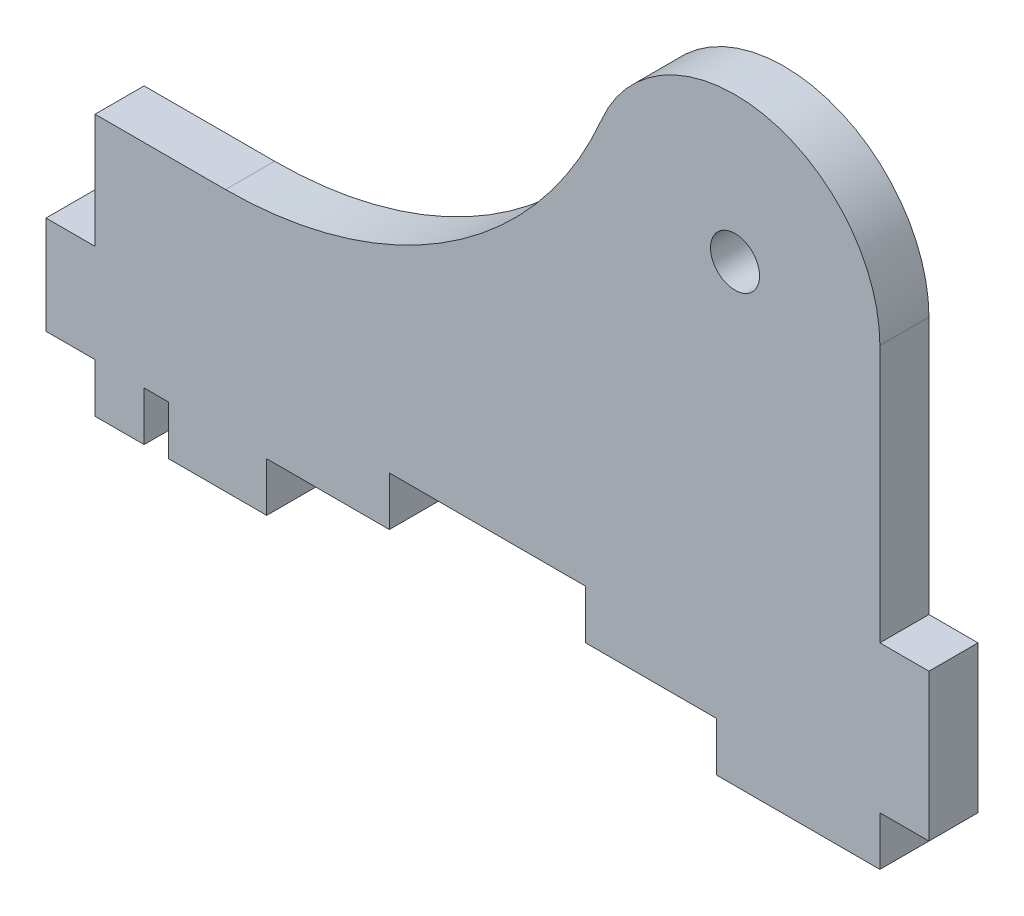
ISO-10303-21;
HEADER;
FILE_DESCRIPTION(('STEP AP214'),'2;1');
FILE_NAME('part.step','',(''),(''),'','','');
FILE_SCHEMA(('AUTOMOTIVE_DESIGN { 1 0 10303 214 1 1 1 1 }'));
ENDSEC;
DATA;
#1=APPLICATION_CONTEXT('core data for automotive mechanical design processes');
#2=APPLICATION_PROTOCOL_DEFINITION('international standard','automotive_design',2000,#1);
#3=PRODUCT_CONTEXT('',#1,'mechanical');
#4=PRODUCT('Part','Part','',(#3));
#5=PRODUCT_RELATED_PRODUCT_CATEGORY('part','',(#4));
#6=PRODUCT_DEFINITION_FORMATION('','',#4);
#7=PRODUCT_DEFINITION_CONTEXT('part definition',#1,'design');
#8=PRODUCT_DEFINITION('design','',#6,#7);
#9=PRODUCT_DEFINITION_SHAPE('','',#8);
#10=(LENGTH_UNIT() NAMED_UNIT(*) SI_UNIT(.MILLI.,.METRE.));
#11=(NAMED_UNIT(*) PLANE_ANGLE_UNIT() SI_UNIT($,.RADIAN.));
#12=(NAMED_UNIT(*) SI_UNIT($,.STERADIAN.) SOLID_ANGLE_UNIT());
#13=UNCERTAINTY_MEASURE_WITH_UNIT(LENGTH_MEASURE(1.E-05),#10,'distance_accuracy_value','');
#14=(GEOMETRIC_REPRESENTATION_CONTEXT(3) GLOBAL_UNCERTAINTY_ASSIGNED_CONTEXT((#13)) GLOBAL_UNIT_ASSIGNED_CONTEXT((#10,
#11,#12)) REPRESENTATION_CONTEXT('',''));
#15=CARTESIAN_POINT('',(0.,0.,0.));
#16=DIRECTION('',(0.,0.,1.));
#17=DIRECTION('',(1.,0.,0.));
#18=AXIS2_PLACEMENT_3D('',#15,#16,#17);
#19=CARTESIAN_POINT('',(0.,0.,-3.));
#20=DIRECTION('',(0.,-1.,0.));
#21=DIRECTION('',(0.,0.,-1.));
#22=AXIS2_PLACEMENT_3D('',#19,#20,#21);
#23=PLANE('',#22);
#24=DIRECTION('',(1.,0.,0.));
#25=VECTOR('',#24,1.);
#26=CARTESIAN_POINT('',(0.,0.,0.));
#27=LINE('',#26,#25);
#28=CARTESIAN_POINT('',(48.,0.,0.));
#29=VERTEX_POINT('',#28);
#30=CARTESIAN_POINT('',(51.,0.,0.));
#31=VERTEX_POINT('',#30);
#32=EDGE_CURVE('E385',#29,#31,#27,.T.);
#33=ORIENTED_EDGE('',*,*,#32,.F.);
#34=DIRECTION('',(0.,0.,1.));
#35=VECTOR('',#34,1.);
#36=CARTESIAN_POINT('',(48.,0.,-3.));
#37=LINE('',#36,#35);
#38=CARTESIAN_POINT('',(48.,0.,-3.));
#39=VERTEX_POINT('',#38);
#40=EDGE_CURVE('E214',#39,#29,#37,.T.);
#41=ORIENTED_EDGE('',*,*,#40,.F.);
#42=DIRECTION('',(1.,0.,0.));
#43=VECTOR('',#42,1.);
#44=CARTESIAN_POINT('',(0.,0.,-3.));
#45=LINE('',#44,#43);
#46=CARTESIAN_POINT('',(51.,0.,-3.));
#47=VERTEX_POINT('',#46);
#48=EDGE_CURVE('E365',#39,#47,#45,.T.);
#49=ORIENTED_EDGE('',*,*,#48,.T.);
#50=DIRECTION('',(0.,0.,1.));
#51=VECTOR('',#50,1.);
#52=CARTESIAN_POINT('',(51.,0.,-3.));
#53=LINE('',#52,#51);
#54=EDGE_CURVE('E247',#47,#31,#53,.T.);
#55=ORIENTED_EDGE('',*,*,#54,.T.);
#56=EDGE_LOOP('',(#33,#41,#49,#55));
#57=FACE_BOUND('',#56,.T.);
#58=ADVANCED_FACE('F36',(#57),#23,.T.);
#59=CARTESIAN_POINT('',(48.,0.,-3.));
#60=DIRECTION('',(1.,0.,0.));
#61=DIRECTION('',(0.,0.,-1.));
#62=AXIS2_PLACEMENT_3D('',#59,#60,#61);
#63=PLANE('',#62);
#64=DIRECTION('',(0.,1.,0.));
#65=VECTOR('',#64,1.);
#66=CARTESIAN_POINT('',(48.,0.,0.));
#67=LINE('',#66,#65);
#68=CARTESIAN_POINT('',(48.,9.,0.));
#69=VERTEX_POINT('',#68);
#70=CARTESIAN_POINT('',(48.,24.75,0.));
#71=VERTEX_POINT('',#70);
#72=EDGE_CURVE('E389',#69,#71,#67,.T.);
#73=ORIENTED_EDGE('',*,*,#72,.F.);
#74=DIRECTION('',(0.,0.,1.));
#75=VECTOR('',#74,1.);
#76=CARTESIAN_POINT('',(48.,9.,-3.));
#77=LINE('',#76,#75);
#78=CARTESIAN_POINT('',(48.,9.,-3.));
#79=VERTEX_POINT('',#78);
#80=EDGE_CURVE('E250',#79,#69,#77,.T.);
#81=ORIENTED_EDGE('',*,*,#80,.F.);
#82=DIRECTION('',(0.,1.,0.));
#83=VECTOR('',#82,1.);
#84=CARTESIAN_POINT('',(48.,0.,-3.));
#85=LINE('',#84,#83);
#86=CARTESIAN_POINT('',(48.,24.75,-3.));
#87=VERTEX_POINT('',#86);
#88=EDGE_CURVE('E370',#79,#87,#85,.T.);
#89=ORIENTED_EDGE('',*,*,#88,.T.);
#90=DIRECTION('',(0.,0.,1.));
#91=VECTOR('',#90,1.);
#92=CARTESIAN_POINT('',(48.,24.75,-3.));
#93=LINE('',#92,#91);
#94=EDGE_CURVE('E40',#87,#71,#93,.T.);
#95=ORIENTED_EDGE('',*,*,#94,.T.);
#96=EDGE_LOOP('',(#73,#81,#89,#95));
#97=FACE_BOUND('',#96,.T.);
#98=ADVANCED_FACE('F409',(#97),#63,.T.);
#99=CARTESIAN_POINT('',(10.5,0.,0.));
#100=VERTEX_POINT('',#99);
#101=CARTESIAN_POINT('',(18.,0.,0.));
#102=VERTEX_POINT('',#101);
#103=EDGE_CURVE('E446',#100,#102,#27,.T.);
#104=ORIENTED_EDGE('',*,*,#103,.F.);
#105=DIRECTION('',(0.,0.,1.));
#106=VECTOR('',#105,1.);
#107=CARTESIAN_POINT('',(10.5,0.,-3.));
#108=LINE('',#107,#106);
#109=CARTESIAN_POINT('',(10.5,0.,-3.));
#110=VERTEX_POINT('',#109);
#111=EDGE_CURVE('E266',#110,#100,#108,.T.);
#112=ORIENTED_EDGE('',*,*,#111,.F.);
#113=CARTESIAN_POINT('',(18.,0.,-3.));
#114=VERTEX_POINT('',#113);
#115=EDGE_CURVE('E512',#110,#114,#45,.T.);
#116=ORIENTED_EDGE('',*,*,#115,.T.);
#117=DIRECTION('',(0.,0.,1.));
#118=VECTOR('',#117,1.);
#119=CARTESIAN_POINT('',(18.,0.,-3.));
#120=LINE('',#119,#118);
#121=EDGE_CURVE('E355',#114,#102,#120,.T.);
#122=ORIENTED_EDGE('',*,*,#121,.T.);
#123=EDGE_LOOP('',(#104,#112,#116,#122));
#124=FACE_BOUND('',#123,.T.);
#125=ADVANCED_FACE('F473',(#124),#23,.T.);
#126=DIRECTION('',(0.,0.,1.));
#127=VECTOR('',#126,1.);
#128=CARTESIAN_POINT('',(4.5,0.,-3.));
#129=LINE('',#128,#127);
#130=CARTESIAN_POINT('',(4.5,0.,-3.));
#131=VERTEX_POINT('',#130);
#132=CARTESIAN_POINT('',(4.5,0.,0.));
#133=VERTEX_POINT('',#132);
#134=EDGE_CURVE('E279',#131,#133,#129,.T.);
#135=ORIENTED_EDGE('',*,*,#134,.T.);
#136=CARTESIAN_POINT('',(3.,0.,0.));
#137=VERTEX_POINT('',#136);
#138=EDGE_CURVE('E390',#137,#133,#27,.T.);
#139=ORIENTED_EDGE('',*,*,#138,.F.);
#140=DIRECTION('',(0.,0.,1.));
#141=VECTOR('',#140,1.);
#142=CARTESIAN_POINT('',(3.,0.,-3.));
#143=LINE('',#142,#141);
#144=CARTESIAN_POINT('',(3.,0.,-3.));
#145=VERTEX_POINT('',#144);
#146=EDGE_CURVE('E284',#145,#137,#143,.T.);
#147=ORIENTED_EDGE('',*,*,#146,.F.);
#148=EDGE_CURVE('E371',#145,#131,#45,.T.);
#149=ORIENTED_EDGE('',*,*,#148,.T.);
#150=EDGE_LOOP('',(#135,#139,#147,#149));
#151=FACE_BOUND('',#150,.T.);
#152=ADVANCED_FACE('F479',(#151),#23,.T.);
#153=CARTESIAN_POINT('',(0.,13.,-3.));
#154=DIRECTION('',(-1.,0.,0.));
#155=DIRECTION('',(0.,0.,1.));
#156=AXIS2_PLACEMENT_3D('',#153,#154,#155);
#157=PLANE('',#156);
#158=DIRECTION('',(0.,-1.,0.));
#159=VECTOR('',#158,1.);
#160=CARTESIAN_POINT('',(0.,13.,-3.));
#161=LINE('',#160,#159);
#162=CARTESIAN_POINT('',(0.,13.,-3.));
#163=VERTEX_POINT('',#162);
#164=CARTESIAN_POINT('',(0.,6.,-3.));
#165=VERTEX_POINT('',#164);
#166=EDGE_CURVE('E362',#163,#165,#161,.T.);
#167=ORIENTED_EDGE('',*,*,#166,.T.);
#168=DIRECTION('',(0.,0.,1.));
#169=VECTOR('',#168,1.);
#170=CARTESIAN_POINT('',(0.,6.,-3.));
#171=LINE('',#170,#169);
#172=CARTESIAN_POINT('',(0.,6.,0.));
#173=VERTEX_POINT('',#172);
#174=EDGE_CURVE('E325',#165,#173,#171,.T.);
#175=ORIENTED_EDGE('',*,*,#174,.T.);
#176=DIRECTION('',(0.,-1.,0.));
#177=VECTOR('',#176,1.);
#178=CARTESIAN_POINT('',(0.,13.,0.));
#179=LINE('',#178,#177);
#180=CARTESIAN_POINT('',(0.,13.,0.));
#181=VERTEX_POINT('',#180);
#182=EDGE_CURVE('E354',#181,#173,#179,.T.);
#183=ORIENTED_EDGE('',*,*,#182,.F.);
#184=DIRECTION('',(0.,0.,1.));
#185=VECTOR('',#184,1.);
#186=CARTESIAN_POINT('',(0.,13.,-3.));
#187=LINE('',#186,#185);
#188=EDGE_CURVE('E11',#163,#181,#187,.T.);
#189=ORIENTED_EDGE('',*,*,#188,.F.);
#190=EDGE_LOOP('',(#167,#175,#183,#189));
#191=FACE_BOUND('',#190,.T.);
#192=ADVANCED_FACE('F38',(#191),#157,.T.);
#193=DIRECTION('',(0.,0.,1.));
#194=VECTOR('',#193,1.);
#195=CARTESIAN_POINT('',(0.,0.,-3.));
#196=LINE('',#195,#194);
#197=CARTESIAN_POINT('',(0.,0.,-3.));
#198=VERTEX_POINT('',#197);
#199=CARTESIAN_POINT('',(0.,0.,0.));
#200=VERTEX_POINT('',#199);
#201=EDGE_CURVE('E288',#198,#200,#196,.T.);
#202=ORIENTED_EDGE('',*,*,#201,.T.);
#203=CARTESIAN_POINT('',(-3.,0.,0.));
#204=VERTEX_POINT('',#203);
#205=EDGE_CURVE('E386',#204,#200,#27,.T.);
#206=ORIENTED_EDGE('',*,*,#205,.F.);
#207=DIRECTION('',(0.,0.,1.));
#208=VECTOR('',#207,1.);
#209=CARTESIAN_POINT('',(-3.,0.,-3.));
#210=LINE('',#209,#208);
#211=CARTESIAN_POINT('',(-3.,0.,-3.));
#212=VERTEX_POINT('',#211);
#213=EDGE_CURVE('E317',#212,#204,#210,.T.);
#214=ORIENTED_EDGE('',*,*,#213,.F.);
#215=EDGE_CURVE('E367',#212,#198,#45,.T.);
#216=ORIENTED_EDGE('',*,*,#215,.T.);
#217=EDGE_LOOP('',(#202,#206,#214,#216));
#218=FACE_BOUND('',#217,.T.);
#219=ADVANCED_FACE('F432',(#218),#23,.T.);
#220=CARTESIAN_POINT('',(7.98013639310981,13.,-3.));
#221=DIRECTION('',(0.,1.,0.));
#222=DIRECTION('',(-1.,0.,0.));
#223=AXIS2_PLACEMENT_3D('',#220,#221,#222);
#224=PLANE('',#223);
#225=DIRECTION('',(-1.,0.,0.));
#226=VECTOR('',#225,1.);
#227=CARTESIAN_POINT('',(7.98013639310981,13.,0.));
#228=LINE('',#227,#226);
#229=CARTESIAN_POINT('',(7.98013639310981,13.,0.));
#230=VERTEX_POINT('',#229);
#231=EDGE_CURVE('E366',#230,#181,#228,.T.);
#232=ORIENTED_EDGE('',*,*,#231,.F.);
#233=DIRECTION('',(0.,0.,1.));
#234=VECTOR('',#233,1.);
#235=CARTESIAN_POINT('',(7.98013639310981,13.,-3.));
#236=LINE('',#235,#234);
#237=CARTESIAN_POINT('',(7.98013639310981,13.,-3.));
#238=VERTEX_POINT('',#237);
#239=EDGE_CURVE('E45',#238,#230,#236,.T.);
#240=ORIENTED_EDGE('',*,*,#239,.F.);
#241=DIRECTION('',(-1.,0.,0.));
#242=VECTOR('',#241,1.);
#243=CARTESIAN_POINT('',(7.98013639310981,13.,-3.));
#244=LINE('',#243,#242);
#245=EDGE_CURVE('E380',#238,#163,#244,.T.);
#246=ORIENTED_EDGE('',*,*,#245,.T.);
#247=ORIENTED_EDGE('',*,*,#188,.T.);
#248=EDGE_LOOP('',(#232,#240,#246,#247));
#249=FACE_BOUND('',#248,.T.);
#250=ADVANCED_FACE('F417',(#249),#224,.T.);
#251=CARTESIAN_POINT('',(7.98013639310981,38.,-3.));
#252=DIRECTION('',(0.,0.,1.));
#253=DIRECTION('',(1.,0.,0.));
#254=AXIS2_PLACEMENT_3D('',#251,#252,#253);
#255=CYLINDRICAL_SURFACE('',#254,25.);
#256=CARTESIAN_POINT('',(7.98013639310981,38.,0.));
#257=DIRECTION('',(0.,0.,-1.));
#258=DIRECTION('',(-1.,0.,0.));
#259=AXIS2_PLACEMENT_3D('',#256,#257,#258);
#260=CIRCLE('',#259,25.);
#261=CARTESIAN_POINT('',(30.9865330313926,28.217070289427,0.));
#262=VERTEX_POINT('',#261);
#263=EDGE_CURVE('E396',#262,#230,#260,.T.);
#264=ORIENTED_EDGE('',*,*,#263,.F.);
#265=DIRECTION('',(0.,0.,1.));
#266=VECTOR('',#265,1.);
#267=CARTESIAN_POINT('',(30.9865330313926,28.217070289427,-3.));
#268=LINE('',#267,#266);
#269=CARTESIAN_POINT('',(30.9865330313926,28.217070289427,-3.));
#270=VERTEX_POINT('',#269);
#271=EDGE_CURVE('E401',#270,#262,#268,.T.);
#272=ORIENTED_EDGE('',*,*,#271,.F.);
#273=CARTESIAN_POINT('',(7.98013639310981,38.,-3.));
#274=DIRECTION('',(0.,0.,-1.));
#275=DIRECTION('',(-1.,0.,0.));
#276=AXIS2_PLACEMENT_3D('',#273,#274,#275);
#277=CIRCLE('',#276,25.);
#278=EDGE_CURVE('E377',#270,#238,#277,.T.);
#279=ORIENTED_EDGE('',*,*,#278,.T.);
#280=ORIENTED_EDGE('',*,*,#239,.T.);
#281=EDGE_LOOP('',(#264,#272,#279,#280));
#282=FACE_BOUND('',#281,.T.);
#283=ADVANCED_FACE('F462',(#282),#255,.F.);
#284=CARTESIAN_POINT('',(39.14,24.75,-3.));
#285=DIRECTION('',(0.,0.,1.));
#286=DIRECTION('',(1.,0.,0.));
#287=AXIS2_PLACEMENT_3D('',#284,#285,#286);
#288=CYLINDRICAL_SURFACE('',#287,8.85999999999999);
#289=CARTESIAN_POINT('',(39.14,24.75,0.));
#290=DIRECTION('',(0.,0.,1.));
#291=DIRECTION('',(1.,0.,0.));
#292=AXIS2_PLACEMENT_3D('',#289,#290,#291);
#293=CIRCLE('',#292,8.85999999999999);
#294=EDGE_CURVE('E393',#71,#262,#293,.T.);
#295=ORIENTED_EDGE('',*,*,#294,.F.);
#296=ORIENTED_EDGE('',*,*,#94,.F.);
#297=CARTESIAN_POINT('',(39.14,24.75,-3.));
#298=DIRECTION('',(0.,0.,1.));
#299=DIRECTION('',(1.,0.,0.));
#300=AXIS2_PLACEMENT_3D('',#297,#298,#299);
#301=CIRCLE('',#300,8.85999999999999);
#302=EDGE_CURVE('E374',#87,#270,#301,.T.);
#303=ORIENTED_EDGE('',*,*,#302,.T.);
#304=ORIENTED_EDGE('',*,*,#271,.T.);
#305=EDGE_LOOP('',(#295,#296,#303,#304));
#306=FACE_BOUND('',#305,.T.);
#307=ADVANCED_FACE('F413',(#306),#288,.T.);
#308=DIRECTION('',(0.,0.,1.));
#309=VECTOR('',#308,1.);
#310=CARTESIAN_POINT('',(38.,0.,-3.));
#311=LINE('',#310,#309);
#312=CARTESIAN_POINT('',(38.,0.,-3.));
#313=VERTEX_POINT('',#312);
#314=CARTESIAN_POINT('',(38.,0.,0.));
#315=VERTEX_POINT('',#314);
#316=EDGE_CURVE('E216',#313,#315,#311,.T.);
#317=ORIENTED_EDGE('',*,*,#316,.T.);
#318=CARTESIAN_POINT('',(30.,0.,0.));
#319=VERTEX_POINT('',#318);
#320=EDGE_CURVE('E391',#319,#315,#27,.T.);
#321=ORIENTED_EDGE('',*,*,#320,.F.);
#322=DIRECTION('',(0.,0.,1.));
#323=VECTOR('',#322,1.);
#324=CARTESIAN_POINT('',(30.,0.,-3.));
#325=LINE('',#324,#323);
#326=CARTESIAN_POINT('',(30.,0.,-3.));
#327=VERTEX_POINT('',#326);
#328=EDGE_CURVE('E352',#327,#319,#325,.T.);
#329=ORIENTED_EDGE('',*,*,#328,.F.);
#330=EDGE_CURVE('E372',#327,#313,#45,.T.);
#331=ORIENTED_EDGE('',*,*,#330,.T.);
#332=EDGE_LOOP('',(#317,#321,#329,#331));
#333=FACE_BOUND('',#332,.T.);
#334=ADVANCED_FACE('F469',(#333),#23,.T.);
#335=CARTESIAN_POINT('',(39.14,24.75,-3.));
#336=DIRECTION('',(0.,0.,1.));
#337=DIRECTION('',(1.,0.,0.));
#338=AXIS2_PLACEMENT_3D('',#335,#336,#337);
#339=PLANE('',#338);
#340=CARTESIAN_POINT('',(39.14,24.75,-3.));
#341=DIRECTION('',(0.,0.,1.));
#342=DIRECTION('',(1.,0.,0.));
#343=AXIS2_PLACEMENT_3D('',#340,#341,#342);
#344=CIRCLE('',#343,1.49999999999999);
#345=CARTESIAN_POINT('',(40.64,24.75,-3.));
#346=VERTEX_POINT('',#345);
#347=EDGE_CURVE('E332',#346,#346,#344,.T.);
#348=ORIENTED_EDGE('',*,*,#347,.T.);
#349=EDGE_LOOP('',(#348));
#350=FACE_BOUND('',#349,.T.);
#351=ORIENTED_EDGE('',*,*,#330,.F.);
#352=DIRECTION('',(0.,1.,0.));
#353=VECTOR('',#352,1.);
#354=CARTESIAN_POINT('',(30.,0.,-3.));
#355=LINE('',#354,#353);
#356=CARTESIAN_POINT('',(30.,3.,-3.));
#357=VERTEX_POINT('',#356);
#358=EDGE_CURVE('E336',#327,#357,#355,.T.);
#359=ORIENTED_EDGE('',*,*,#358,.T.);
#360=DIRECTION('',(-1.,0.,0.));
#361=VECTOR('',#360,1.);
#362=CARTESIAN_POINT('',(30.,3.,-3.));
#363=LINE('',#362,#361);
#364=CARTESIAN_POINT('',(18.,3.,-3.));
#365=VERTEX_POINT('',#364);
#366=EDGE_CURVE('E339',#357,#365,#363,.T.);
#367=ORIENTED_EDGE('',*,*,#366,.T.);
#368=DIRECTION('',(0.,1.,0.));
#369=VECTOR('',#368,1.);
#370=CARTESIAN_POINT('',(18.,0.,-3.));
#371=LINE('',#370,#369);
#372=EDGE_CURVE('E343',#114,#365,#371,.T.);
#373=ORIENTED_EDGE('',*,*,#372,.F.);
#374=ORIENTED_EDGE('',*,*,#115,.F.);
#375=DIRECTION('',(0.,-1.,0.));
#376=VECTOR('',#375,1.);
#377=CARTESIAN_POINT('',(10.5,0.,-3.));
#378=LINE('',#377,#376);
#379=CARTESIAN_POINT('',(10.5,-3.,-3.));
#380=VERTEX_POINT('',#379);
#381=EDGE_CURVE('E257',#110,#380,#378,.T.);
#382=ORIENTED_EDGE('',*,*,#381,.T.);
#383=DIRECTION('',(1.,0.,0.));
#384=VECTOR('',#383,1.);
#385=CARTESIAN_POINT('',(0.,-3.,-3.));
#386=LINE('',#385,#384);
#387=CARTESIAN_POINT('',(4.5,-3.,-3.));
#388=VERTEX_POINT('',#387);
#389=EDGE_CURVE('E263',#388,#380,#386,.T.);
#390=ORIENTED_EDGE('',*,*,#389,.F.);
#391=DIRECTION('',(0.,-1.,0.));
#392=VECTOR('',#391,1.);
#393=CARTESIAN_POINT('',(4.5,0.,-3.));
#394=LINE('',#393,#392);
#395=EDGE_CURVE('E259',#131,#388,#394,.T.);
#396=ORIENTED_EDGE('',*,*,#395,.F.);
#397=ORIENTED_EDGE('',*,*,#148,.F.);
#398=DIRECTION('',(0.,-1.,0.));
#399=VECTOR('',#398,1.);
#400=CARTESIAN_POINT('',(3.,0.,-3.));
#401=LINE('',#400,#399);
#402=CARTESIAN_POINT('',(3.,-3.,-3.));
#403=VERTEX_POINT('',#402);
#404=EDGE_CURVE('E291',#145,#403,#401,.T.);
#405=ORIENTED_EDGE('',*,*,#404,.T.);
#406=DIRECTION('',(1.,0.,0.));
#407=VECTOR('',#406,1.);
#408=CARTESIAN_POINT('',(0.,-3.,-3.));
#409=LINE('',#408,#407);
#410=CARTESIAN_POINT('',(0.,-3.,-3.));
#411=VERTEX_POINT('',#410);
#412=EDGE_CURVE('E287',#411,#403,#409,.T.);
#413=ORIENTED_EDGE('',*,*,#412,.F.);
#414=DIRECTION('',(0.,-1.,0.));
#415=VECTOR('',#414,1.);
#416=CARTESIAN_POINT('',(0.,0.,-3.));
#417=LINE('',#416,#415);
#418=EDGE_CURVE('E294',#198,#411,#417,.T.);
#419=ORIENTED_EDGE('',*,*,#418,.F.);
#420=ORIENTED_EDGE('',*,*,#215,.F.);
#421=DIRECTION('',(0.,1.,0.));
#422=VECTOR('',#421,1.);
#423=CARTESIAN_POINT('',(-3.,0.,-3.));
#424=LINE('',#423,#422);
#425=CARTESIAN_POINT('',(-3.,6.,-3.));
#426=VERTEX_POINT('',#425);
#427=EDGE_CURVE('E311',#212,#426,#424,.T.);
#428=ORIENTED_EDGE('',*,*,#427,.T.);
#429=DIRECTION('',(-1.,0.,0.));
#430=VECTOR('',#429,1.);
#431=CARTESIAN_POINT('',(0.,6.,-3.));
#432=LINE('',#431,#430);
#433=EDGE_CURVE('E313',#165,#426,#432,.T.);
#434=ORIENTED_EDGE('',*,*,#433,.F.);
#435=ORIENTED_EDGE('',*,*,#166,.F.);
#436=ORIENTED_EDGE('',*,*,#245,.F.);
#437=ORIENTED_EDGE('',*,*,#278,.F.);
#438=ORIENTED_EDGE('',*,*,#302,.F.);
#439=ORIENTED_EDGE('',*,*,#88,.F.);
#440=DIRECTION('',(1.,0.,0.));
#441=VECTOR('',#440,1.);
#442=CARTESIAN_POINT('',(0.,9.,-3.));
#443=LINE('',#442,#441);
#444=CARTESIAN_POINT('',(51.,9.,-3.));
#445=VERTEX_POINT('',#444);
#446=EDGE_CURVE('E245',#79,#445,#443,.T.);
#447=ORIENTED_EDGE('',*,*,#446,.T.);
#448=DIRECTION('',(0.,1.,0.));
#449=VECTOR('',#448,1.);
#450=CARTESIAN_POINT('',(51.,0.,-3.));
#451=LINE('',#450,#449);
#452=EDGE_CURVE('E242',#47,#445,#451,.T.);
#453=ORIENTED_EDGE('',*,*,#452,.F.);
#454=ORIENTED_EDGE('',*,*,#48,.F.);
#455=DIRECTION('',(0.,-1.,0.));
#456=VECTOR('',#455,1.);
#457=CARTESIAN_POINT('',(48.,0.,-3.));
#458=LINE('',#457,#456);
#459=CARTESIAN_POINT('',(48.,-3.,-3.));
#460=VERTEX_POINT('',#459);
#461=EDGE_CURVE('E236',#39,#460,#458,.T.);
#462=ORIENTED_EDGE('',*,*,#461,.T.);
#463=DIRECTION('',(-1.,0.,0.));
#464=VECTOR('',#463,1.);
#465=CARTESIAN_POINT('',(0.,-3.00000000000001,-3.));
#466=LINE('',#465,#464);
#467=CARTESIAN_POINT('',(38.,-3.,-3.));
#468=VERTEX_POINT('',#467);
#469=EDGE_CURVE('E224',#460,#468,#466,.T.);
#470=ORIENTED_EDGE('',*,*,#469,.T.);
#471=DIRECTION('',(0.,-1.,0.));
#472=VECTOR('',#471,1.);
#473=CARTESIAN_POINT('',(38.,0.,-3.));
#474=LINE('',#473,#472);
#475=EDGE_CURVE('E225',#313,#468,#474,.T.);
#476=ORIENTED_EDGE('',*,*,#475,.F.);
#477=EDGE_LOOP('',(#351,#359,#367,#373,#374,#382,#390,#396,#397,#405,#413,#419,#420,#428,#434,
#435,#436,#437,#438,#439,#447,#453,#454,#462,#470,#476));
#478=FACE_BOUND('',#477,.T.);
#479=ADVANCED_FACE('F460',(#350,#478),#339,.F.);
#480=CARTESIAN_POINT('',(39.14,24.75,0.));
#481=DIRECTION('',(0.,0.,1.));
#482=DIRECTION('',(1.,0.,0.));
#483=AXIS2_PLACEMENT_3D('',#480,#481,#482);
#484=PLANE('',#483);
#485=CARTESIAN_POINT('',(39.14,24.75,0.));
#486=DIRECTION('',(0.,0.,1.));
#487=DIRECTION('',(1.,0.,0.));
#488=AXIS2_PLACEMENT_3D('',#485,#486,#487);
#489=CIRCLE('',#488,1.49999999999999);
#490=CARTESIAN_POINT('',(40.64,24.75,0.));
#491=VERTEX_POINT('',#490);
#492=EDGE_CURVE('E324',#491,#491,#489,.T.);
#493=ORIENTED_EDGE('',*,*,#492,.F.);
#494=EDGE_LOOP('',(#493));
#495=FACE_BOUND('',#494,.T.);
#496=DIRECTION('',(0.,1.,0.));
#497=VECTOR('',#496,1.);
#498=CARTESIAN_POINT('',(30.,0.,0.));
#499=LINE('',#498,#497);
#500=CARTESIAN_POINT('',(30.,3.,0.));
#501=VERTEX_POINT('',#500);
#502=EDGE_CURVE('E335',#319,#501,#499,.T.);
#503=ORIENTED_EDGE('',*,*,#502,.F.);
#504=ORIENTED_EDGE('',*,*,#320,.T.);
#505=DIRECTION('',(0.,-1.,0.));
#506=VECTOR('',#505,1.);
#507=CARTESIAN_POINT('',(38.,0.,0.));
#508=LINE('',#507,#506);
#509=CARTESIAN_POINT('',(38.,-3.,0.));
#510=VERTEX_POINT('',#509);
#511=EDGE_CURVE('E230',#315,#510,#508,.T.);
#512=ORIENTED_EDGE('',*,*,#511,.T.);
#513=DIRECTION('',(-1.,0.,0.));
#514=VECTOR('',#513,1.);
#515=CARTESIAN_POINT('',(0.,-3.00000000000001,0.));
#516=LINE('',#515,#514);
#517=CARTESIAN_POINT('',(48.,-3.,0.));
#518=VERTEX_POINT('',#517);
#519=EDGE_CURVE('E222',#518,#510,#516,.T.);
#520=ORIENTED_EDGE('',*,*,#519,.F.);
#521=DIRECTION('',(0.,-1.,0.));
#522=VECTOR('',#521,1.);
#523=CARTESIAN_POINT('',(48.,0.,0.));
#524=LINE('',#523,#522);
#525=EDGE_CURVE('E53',#29,#518,#524,.T.);
#526=ORIENTED_EDGE('',*,*,#525,.F.);
#527=ORIENTED_EDGE('',*,*,#32,.T.);
#528=DIRECTION('',(0.,1.,0.));
#529=VECTOR('',#528,1.);
#530=CARTESIAN_POINT('',(51.,0.,0.));
#531=LINE('',#530,#529);
#532=CARTESIAN_POINT('',(51.,9.,0.));
#533=VERTEX_POINT('',#532);
#534=EDGE_CURVE('E235',#31,#533,#531,.T.);
#535=ORIENTED_EDGE('',*,*,#534,.T.);
#536=DIRECTION('',(1.,0.,0.));
#537=VECTOR('',#536,1.);
#538=CARTESIAN_POINT('',(0.,9.,0.));
#539=LINE('',#538,#537);
#540=EDGE_CURVE('E60',#69,#533,#539,.T.);
#541=ORIENTED_EDGE('',*,*,#540,.F.);
#542=ORIENTED_EDGE('',*,*,#72,.T.);
#543=ORIENTED_EDGE('',*,*,#294,.T.);
#544=ORIENTED_EDGE('',*,*,#263,.T.);
#545=ORIENTED_EDGE('',*,*,#231,.T.);
#546=ORIENTED_EDGE('',*,*,#182,.T.);
#547=DIRECTION('',(-1.,0.,0.));
#548=VECTOR('',#547,1.);
#549=CARTESIAN_POINT('',(0.,6.,0.));
#550=LINE('',#549,#548);
#551=CARTESIAN_POINT('',(-3.,6.,0.));
#552=VERTEX_POINT('',#551);
#553=EDGE_CURVE('E314',#173,#552,#550,.T.);
#554=ORIENTED_EDGE('',*,*,#553,.T.);
#555=DIRECTION('',(0.,1.,0.));
#556=VECTOR('',#555,1.);
#557=CARTESIAN_POINT('',(-3.,0.,0.));
#558=LINE('',#557,#556);
#559=EDGE_CURVE('E300',#204,#552,#558,.T.);
#560=ORIENTED_EDGE('',*,*,#559,.F.);
#561=ORIENTED_EDGE('',*,*,#205,.T.);
#562=DIRECTION('',(0.,-1.,0.));
#563=VECTOR('',#562,1.);
#564=CARTESIAN_POINT('',(0.,0.,0.));
#565=LINE('',#564,#563);
#566=CARTESIAN_POINT('',(0.,-3.,0.));
#567=VERTEX_POINT('',#566);
#568=EDGE_CURVE('E301',#200,#567,#565,.T.);
#569=ORIENTED_EDGE('',*,*,#568,.T.);
#570=DIRECTION('',(1.,0.,0.));
#571=VECTOR('',#570,1.);
#572=CARTESIAN_POINT('',(0.,-3.,0.));
#573=LINE('',#572,#571);
#574=CARTESIAN_POINT('',(3.,-3.,0.));
#575=VERTEX_POINT('',#574);
#576=EDGE_CURVE('E297',#567,#575,#573,.T.);
#577=ORIENTED_EDGE('',*,*,#576,.T.);
#578=DIRECTION('',(0.,-1.,0.));
#579=VECTOR('',#578,1.);
#580=CARTESIAN_POINT('',(3.,0.,0.));
#581=LINE('',#580,#579);
#582=EDGE_CURVE('E276',#137,#575,#581,.T.);
#583=ORIENTED_EDGE('',*,*,#582,.F.);
#584=ORIENTED_EDGE('',*,*,#138,.T.);
#585=DIRECTION('',(0.,-1.,0.));
#586=VECTOR('',#585,1.);
#587=CARTESIAN_POINT('',(4.5,0.,0.));
#588=LINE('',#587,#586);
#589=CARTESIAN_POINT('',(4.5,-3.,0.));
#590=VERTEX_POINT('',#589);
#591=EDGE_CURVE('E269',#133,#590,#588,.T.);
#592=ORIENTED_EDGE('',*,*,#591,.T.);
#593=DIRECTION('',(1.,0.,0.));
#594=VECTOR('',#593,1.);
#595=CARTESIAN_POINT('',(0.,-3.,0.));
#596=LINE('',#595,#594);
#597=CARTESIAN_POINT('',(10.5,-3.,0.));
#598=VERTEX_POINT('',#597);
#599=EDGE_CURVE('E260',#590,#598,#596,.T.);
#600=ORIENTED_EDGE('',*,*,#599,.T.);
#601=DIRECTION('',(0.,-1.,0.));
#602=VECTOR('',#601,1.);
#603=CARTESIAN_POINT('',(10.5,0.,0.));
#604=LINE('',#603,#602);
#605=EDGE_CURVE('E252',#100,#598,#604,.T.);
#606=ORIENTED_EDGE('',*,*,#605,.F.);
#607=ORIENTED_EDGE('',*,*,#103,.T.);
#608=DIRECTION('',(0.,1.,0.));
#609=VECTOR('',#608,1.);
#610=CARTESIAN_POINT('',(18.,0.,0.));
#611=LINE('',#610,#609);
#612=CARTESIAN_POINT('',(18.,3.,0.));
#613=VERTEX_POINT('',#612);
#614=EDGE_CURVE('E340',#102,#613,#611,.T.);
#615=ORIENTED_EDGE('',*,*,#614,.T.);
#616=DIRECTION('',(-1.,0.,0.));
#617=VECTOR('',#616,1.);
#618=CARTESIAN_POINT('',(30.,3.,0.));
#619=LINE('',#618,#617);
#620=EDGE_CURVE('E347',#501,#613,#619,.T.);
#621=ORIENTED_EDGE('',*,*,#620,.F.);
#622=EDGE_LOOP('',(#503,#504,#512,#520,#526,#527,#535,#541,#542,#543,#544,#545,#546,#554,#560,
#561,#569,#577,#583,#584,#592,#600,#606,#607,#615,#621));
#623=FACE_BOUND('',#622,.T.);
#624=ADVANCED_FACE('F228',(#495,#623),#484,.T.);
#625=CARTESIAN_POINT('',(30.,0.,-3.));
#626=DIRECTION('',(1.,0.,0.));
#627=DIRECTION('',(0.,0.,-1.));
#628=AXIS2_PLACEMENT_3D('',#625,#626,#627);
#629=PLANE('',#628);
#630=ORIENTED_EDGE('',*,*,#502,.T.);
#631=DIRECTION('',(0.,0.,1.));
#632=VECTOR('',#631,1.);
#633=CARTESIAN_POINT('',(30.,3.,-3.));
#634=LINE('',#633,#632);
#635=EDGE_CURVE('E345',#357,#501,#634,.T.);
#636=ORIENTED_EDGE('',*,*,#635,.F.);
#637=ORIENTED_EDGE('',*,*,#358,.F.);
#638=ORIENTED_EDGE('',*,*,#328,.T.);
#639=EDGE_LOOP('',(#630,#636,#637,#638));
#640=FACE_BOUND('',#639,.T.);
#641=ADVANCED_FACE('F565',(#640),#629,.F.);
#642=CARTESIAN_POINT('',(18.,0.,-3.));
#643=DIRECTION('',(1.,0.,0.));
#644=DIRECTION('',(0.,0.,-1.));
#645=AXIS2_PLACEMENT_3D('',#642,#643,#644);
#646=PLANE('',#645);
#647=ORIENTED_EDGE('',*,*,#614,.F.);
#648=ORIENTED_EDGE('',*,*,#121,.F.);
#649=ORIENTED_EDGE('',*,*,#372,.T.);
#650=DIRECTION('',(0.,0.,1.));
#651=VECTOR('',#650,1.);
#652=CARTESIAN_POINT('',(18.,3.,-3.));
#653=LINE('',#652,#651);
#654=EDGE_CURVE('E358',#365,#613,#653,.T.);
#655=ORIENTED_EDGE('',*,*,#654,.T.);
#656=EDGE_LOOP('',(#647,#648,#649,#655));
#657=FACE_BOUND('',#656,.T.);
#658=ADVANCED_FACE('F515',(#657),#646,.T.);
#659=CARTESIAN_POINT('',(30.,3.,-3.));
#660=DIRECTION('',(0.,1.,0.));
#661=DIRECTION('',(-1.,0.,0.));
#662=AXIS2_PLACEMENT_3D('',#659,#660,#661);
#663=PLANE('',#662);
#664=ORIENTED_EDGE('',*,*,#620,.T.);
#665=ORIENTED_EDGE('',*,*,#654,.F.);
#666=ORIENTED_EDGE('',*,*,#366,.F.);
#667=ORIENTED_EDGE('',*,*,#635,.T.);
#668=EDGE_LOOP('',(#664,#665,#666,#667));
#669=FACE_BOUND('',#668,.T.);
#670=ADVANCED_FACE('F519',(#669),#663,.F.);
#671=CARTESIAN_POINT('',(39.14,24.75,0.));
#672=DIRECTION('',(0.,0.,1.));
#673=DIRECTION('',(1.,0.,0.));
#674=AXIS2_PLACEMENT_3D('',#671,#672,#673);
#675=CYLINDRICAL_SURFACE('',#674,1.49999999999999);
#676=ORIENTED_EDGE('',*,*,#347,.F.);
#677=EDGE_LOOP('',(#676));
#678=FACE_BOUND('',#677,.T.);
#679=ORIENTED_EDGE('',*,*,#492,.T.);
#680=EDGE_LOOP('',(#679));
#681=FACE_BOUND('',#680,.T.);
#682=ADVANCED_FACE('F559',(#678,#681),#675,.F.);
#683=CARTESIAN_POINT('',(-3.,0.,-3.));
#684=DIRECTION('',(1.,0.,0.));
#685=DIRECTION('',(0.,0.,-1.));
#686=AXIS2_PLACEMENT_3D('',#683,#684,#685);
#687=PLANE('',#686);
#688=ORIENTED_EDGE('',*,*,#559,.T.);
#689=DIRECTION('',(0.,0.,1.));
#690=VECTOR('',#689,1.);
#691=CARTESIAN_POINT('',(-3.,6.,-3.));
#692=LINE('',#691,#690);
#693=EDGE_CURVE('E322',#426,#552,#692,.T.);
#694=ORIENTED_EDGE('',*,*,#693,.F.);
#695=ORIENTED_EDGE('',*,*,#427,.F.);
#696=ORIENTED_EDGE('',*,*,#213,.T.);
#697=EDGE_LOOP('',(#688,#694,#695,#696));
#698=FACE_BOUND('',#697,.T.);
#699=ADVANCED_FACE('F429',(#698),#687,.F.);
#700=CARTESIAN_POINT('',(0.,6.,-3.));
#701=DIRECTION('',(0.,1.,0.));
#702=DIRECTION('',(0.,0.,1.));
#703=AXIS2_PLACEMENT_3D('',#700,#701,#702);
#704=PLANE('',#703);
#705=ORIENTED_EDGE('',*,*,#553,.F.);
#706=ORIENTED_EDGE('',*,*,#174,.F.);
#707=ORIENTED_EDGE('',*,*,#433,.T.);
#708=ORIENTED_EDGE('',*,*,#693,.T.);
#709=EDGE_LOOP('',(#705,#706,#707,#708));
#710=FACE_BOUND('',#709,.T.);
#711=ADVANCED_FACE('F424',(#710),#704,.T.);
#712=CARTESIAN_POINT('',(3.,0.,-3.));
#713=DIRECTION('',(-1.,0.,0.));
#714=DIRECTION('',(0.,-1.,0.));
#715=AXIS2_PLACEMENT_3D('',#712,#713,#714);
#716=PLANE('',#715);
#717=ORIENTED_EDGE('',*,*,#582,.T.);
#718=DIRECTION('',(0.,0.,1.));
#719=VECTOR('',#718,1.);
#720=CARTESIAN_POINT('',(3.,-3.,-3.));
#721=LINE('',#720,#719);
#722=EDGE_CURVE('E295',#403,#575,#721,.T.);
#723=ORIENTED_EDGE('',*,*,#722,.F.);
#724=ORIENTED_EDGE('',*,*,#404,.F.);
#725=ORIENTED_EDGE('',*,*,#146,.T.);
#726=EDGE_LOOP('',(#717,#723,#724,#725));
#727=FACE_BOUND('',#726,.T.);
#728=ADVANCED_FACE('F440',(#727),#716,.F.);
#729=CARTESIAN_POINT('',(0.,-3.,-3.));
#730=DIRECTION('',(0.,-1.,0.));
#731=DIRECTION('',(0.,0.,-1.));
#732=AXIS2_PLACEMENT_3D('',#729,#730,#731);
#733=PLANE('',#732);
#734=ORIENTED_EDGE('',*,*,#576,.F.);
#735=DIRECTION('',(0.,0.,1.));
#736=VECTOR('',#735,1.);
#737=CARTESIAN_POINT('',(0.,-3.,-3.));
#738=LINE('',#737,#736);
#739=EDGE_CURVE('E292',#411,#567,#738,.T.);
#740=ORIENTED_EDGE('',*,*,#739,.F.);
#741=ORIENTED_EDGE('',*,*,#412,.T.);
#742=ORIENTED_EDGE('',*,*,#722,.T.);
#743=EDGE_LOOP('',(#734,#740,#741,#742));
#744=FACE_BOUND('',#743,.T.);
#745=ADVANCED_FACE('F436',(#744),#733,.T.);
#746=CARTESIAN_POINT('',(0.,0.,-3.));
#747=DIRECTION('',(-1.,0.,0.));
#748=DIRECTION('',(0.,-1.,0.));
#749=AXIS2_PLACEMENT_3D('',#746,#747,#748);
#750=PLANE('',#749);
#751=ORIENTED_EDGE('',*,*,#568,.F.);
#752=ORIENTED_EDGE('',*,*,#201,.F.);
#753=ORIENTED_EDGE('',*,*,#418,.T.);
#754=ORIENTED_EDGE('',*,*,#739,.T.);
#755=EDGE_LOOP('',(#751,#752,#753,#754));
#756=FACE_BOUND('',#755,.T.);
#757=ADVANCED_FACE('F548',(#756),#750,.T.);
#758=CARTESIAN_POINT('',(10.5,0.,-3.));
#759=DIRECTION('',(-1.,0.,0.));
#760=DIRECTION('',(0.,0.,1.));
#761=AXIS2_PLACEMENT_3D('',#758,#759,#760);
#762=PLANE('',#761);
#763=ORIENTED_EDGE('',*,*,#605,.T.);
#764=DIRECTION('',(0.,0.,1.));
#765=VECTOR('',#764,1.);
#766=CARTESIAN_POINT('',(10.5,-3.,-3.));
#767=LINE('',#766,#765);
#768=EDGE_CURVE('E274',#380,#598,#767,.T.);
#769=ORIENTED_EDGE('',*,*,#768,.F.);
#770=ORIENTED_EDGE('',*,*,#381,.F.);
#771=ORIENTED_EDGE('',*,*,#111,.T.);
#772=EDGE_LOOP('',(#763,#769,#770,#771));
#773=FACE_BOUND('',#772,.T.);
#774=ADVANCED_FACE('F510',(#773),#762,.F.);
#775=CARTESIAN_POINT('',(0.,-3.,-3.));
#776=DIRECTION('',(0.,-1.,0.));
#777=DIRECTION('',(0.,0.,-1.));
#778=AXIS2_PLACEMENT_3D('',#775,#776,#777);
#779=PLANE('',#778);
#780=ORIENTED_EDGE('',*,*,#599,.F.);
#781=DIRECTION('',(0.,0.,1.));
#782=VECTOR('',#781,1.);
#783=CARTESIAN_POINT('',(4.5,-3.,-3.));
#784=LINE('',#783,#782);
#785=EDGE_CURVE('E277',#388,#590,#784,.T.);
#786=ORIENTED_EDGE('',*,*,#785,.F.);
#787=ORIENTED_EDGE('',*,*,#389,.T.);
#788=ORIENTED_EDGE('',*,*,#768,.T.);
#789=EDGE_LOOP('',(#780,#786,#787,#788));
#790=FACE_BOUND('',#789,.T.);
#791=ADVANCED_FACE('F505',(#790),#779,.T.);
#792=CARTESIAN_POINT('',(4.5,0.,-3.));
#793=DIRECTION('',(-1.,0.,0.));
#794=DIRECTION('',(0.,0.,1.));
#795=AXIS2_PLACEMENT_3D('',#792,#793,#794);
#796=PLANE('',#795);
#797=ORIENTED_EDGE('',*,*,#591,.F.);
#798=ORIENTED_EDGE('',*,*,#134,.F.);
#799=ORIENTED_EDGE('',*,*,#395,.T.);
#800=ORIENTED_EDGE('',*,*,#785,.T.);
#801=EDGE_LOOP('',(#797,#798,#799,#800));
#802=FACE_BOUND('',#801,.T.);
#803=ADVANCED_FACE('F500',(#802),#796,.T.);
#804=CARTESIAN_POINT('',(0.,9.,-3.));
#805=DIRECTION('',(0.,-1.,0.));
#806=DIRECTION('',(0.,0.,-1.));
#807=AXIS2_PLACEMENT_3D('',#804,#805,#806);
#808=PLANE('',#807);
#809=ORIENTED_EDGE('',*,*,#540,.T.);
#810=DIRECTION('',(0.,0.,1.));
#811=VECTOR('',#810,1.);
#812=CARTESIAN_POINT('',(51.,9.,-3.));
#813=LINE('',#812,#811);
#814=EDGE_CURVE('E253',#445,#533,#813,.T.);
#815=ORIENTED_EDGE('',*,*,#814,.F.);
#816=ORIENTED_EDGE('',*,*,#446,.F.);
#817=ORIENTED_EDGE('',*,*,#80,.T.);
#818=EDGE_LOOP('',(#809,#815,#816,#817));
#819=FACE_BOUND('',#818,.T.);
#820=ADVANCED_FACE('F457',(#819),#808,.F.);
#821=CARTESIAN_POINT('',(51.,0.,-3.));
#822=DIRECTION('',(1.,0.,0.));
#823=DIRECTION('',(0.,0.,-1.));
#824=AXIS2_PLACEMENT_3D('',#821,#822,#823);
#825=PLANE('',#824);
#826=ORIENTED_EDGE('',*,*,#534,.F.);
#827=ORIENTED_EDGE('',*,*,#54,.F.);
#828=ORIENTED_EDGE('',*,*,#452,.T.);
#829=ORIENTED_EDGE('',*,*,#814,.T.);
#830=EDGE_LOOP('',(#826,#827,#828,#829));
#831=FACE_BOUND('',#830,.T.);
#832=ADVANCED_FACE('F454',(#831),#825,.T.);
#833=CARTESIAN_POINT('',(48.,0.,-3.));
#834=DIRECTION('',(-1.,0.,0.));
#835=DIRECTION('',(0.,0.,1.));
#836=AXIS2_PLACEMENT_3D('',#833,#834,#835);
#837=PLANE('',#836);
#838=ORIENTED_EDGE('',*,*,#525,.T.);
#839=DIRECTION('',(0.,0.,1.));
#840=VECTOR('',#839,1.);
#841=CARTESIAN_POINT('',(48.,-3.,-3.));
#842=LINE('',#841,#840);
#843=EDGE_CURVE('E211',#460,#518,#842,.T.);
#844=ORIENTED_EDGE('',*,*,#843,.F.);
#845=ORIENTED_EDGE('',*,*,#461,.F.);
#846=ORIENTED_EDGE('',*,*,#40,.T.);
#847=EDGE_LOOP('',(#838,#844,#845,#846));
#848=FACE_BOUND('',#847,.T.);
#849=ADVANCED_FACE('F210',(#848),#837,.F.);
#850=CARTESIAN_POINT('',(0.,-3.00000000000001,-3.));
#851=DIRECTION('',(0.,1.,0.));
#852=DIRECTION('',(-1.,0.,0.));
#853=AXIS2_PLACEMENT_3D('',#850,#851,#852);
#854=PLANE('',#853);
#855=ORIENTED_EDGE('',*,*,#519,.T.);
#856=DIRECTION('',(0.,0.,1.));
#857=VECTOR('',#856,1.);
#858=CARTESIAN_POINT('',(38.,-3.,-3.));
#859=LINE('',#858,#857);
#860=EDGE_CURVE('E238',#468,#510,#859,.T.);
#861=ORIENTED_EDGE('',*,*,#860,.F.);
#862=ORIENTED_EDGE('',*,*,#469,.F.);
#863=ORIENTED_EDGE('',*,*,#843,.T.);
#864=EDGE_LOOP('',(#855,#861,#862,#863));
#865=FACE_BOUND('',#864,.T.);
#866=ADVANCED_FACE('F220',(#865),#854,.F.);
#867=CARTESIAN_POINT('',(38.,0.,-3.));
#868=DIRECTION('',(-1.,0.,0.));
#869=DIRECTION('',(0.,0.,1.));
#870=AXIS2_PLACEMENT_3D('',#867,#868,#869);
#871=PLANE('',#870);
#872=ORIENTED_EDGE('',*,*,#511,.F.);
#873=ORIENTED_EDGE('',*,*,#316,.F.);
#874=ORIENTED_EDGE('',*,*,#475,.T.);
#875=ORIENTED_EDGE('',*,*,#860,.T.);
#876=EDGE_LOOP('',(#872,#873,#874,#875));
#877=FACE_BOUND('',#876,.T.);
#878=ADVANCED_FACE('F528',(#877),#871,.T.);
#879=CLOSED_SHELL('',(#58,#98,#125,#152,#192,#219,#250,#283,#307,#334,#479,#624,#641,#658,#670,
#682,#699,#711,#728,#745,#757,#774,#791,#803,#820,#832,#849,#866,#878));
#880=MANIFOLD_SOLID_BREP('B2',#879);
#881=ADVANCED_BREP_SHAPE_REPRESENTATION('',(#18,#880),#14);
#882=SHAPE_DEFINITION_REPRESENTATION(#9,#881);
ENDSEC;
END-ISO-10303-21;
